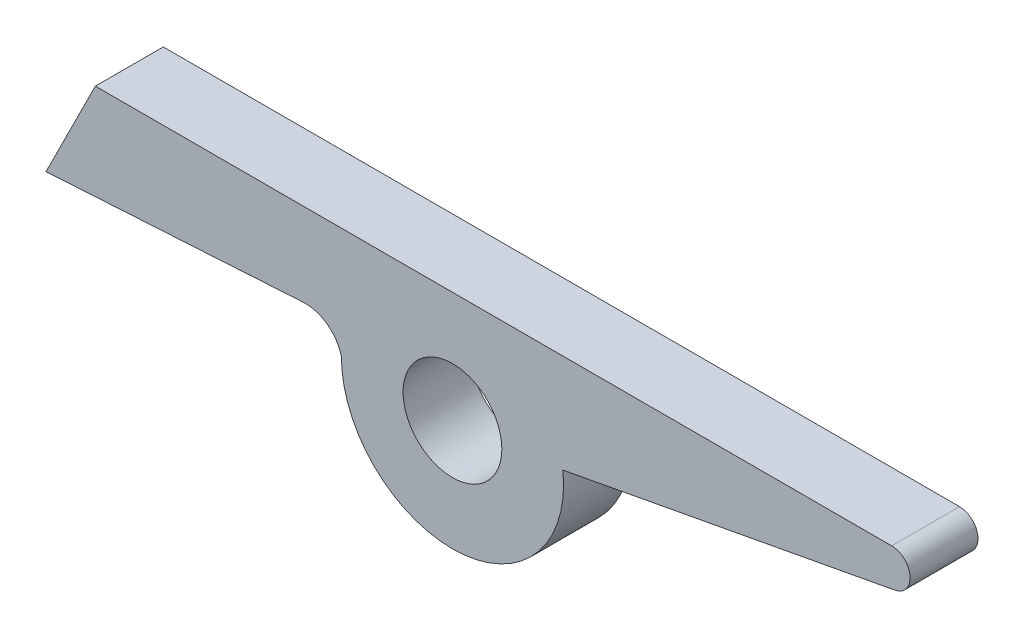
ISO-10303-21;
HEADER;
FILE_DESCRIPTION(('STEP AP214'),'2;1');
FILE_NAME('part.step','',(''),(''),'','','');
FILE_SCHEMA(('AUTOMOTIVE_DESIGN { 1 0 10303 214 1 1 1 1 }'));
ENDSEC;
DATA;
#1=APPLICATION_CONTEXT('core data for automotive mechanical design processes');
#2=APPLICATION_PROTOCOL_DEFINITION('international standard','automotive_design',2000,#1);
#3=PRODUCT_CONTEXT('',#1,'mechanical');
#4=PRODUCT('Part','Part','',(#3));
#5=PRODUCT_RELATED_PRODUCT_CATEGORY('part','',(#4));
#6=PRODUCT_DEFINITION_FORMATION('','',#4);
#7=PRODUCT_DEFINITION_CONTEXT('part definition',#1,'design');
#8=PRODUCT_DEFINITION('design','',#6,#7);
#9=PRODUCT_DEFINITION_SHAPE('','',#8);
#10=(LENGTH_UNIT() NAMED_UNIT(*) SI_UNIT(.MILLI.,.METRE.));
#11=(NAMED_UNIT(*) PLANE_ANGLE_UNIT() SI_UNIT($,.RADIAN.));
#12=(NAMED_UNIT(*) SI_UNIT($,.STERADIAN.) SOLID_ANGLE_UNIT());
#13=UNCERTAINTY_MEASURE_WITH_UNIT(LENGTH_MEASURE(1.E-05),#10,'distance_accuracy_value','');
#14=(GEOMETRIC_REPRESENTATION_CONTEXT(3) GLOBAL_UNCERTAINTY_ASSIGNED_CONTEXT((#13)) GLOBAL_UNIT_ASSIGNED_CONTEXT((#10,
#11,#12)) REPRESENTATION_CONTEXT('',''));
#15=CARTESIAN_POINT('',(0.,0.,0.));
#16=DIRECTION('',(0.,0.,1.));
#17=DIRECTION('',(1.,0.,0.));
#18=AXIS2_PLACEMENT_3D('',#15,#16,#17);
#19=CARTESIAN_POINT('',(35.5726988460086,7.5,5.5));
#20=DIRECTION('',(0.,0.,-1.));
#21=DIRECTION('',(-1.,0.,0.));
#22=AXIS2_PLACEMENT_3D('',#19,#20,#21);
#23=CYLINDRICAL_SURFACE('',#22,1.5);
#24=CARTESIAN_POINT('',(35.5726988460086,7.5,0.));
#25=DIRECTION('',(0.,0.,1.));
#26=DIRECTION('',(1.,0.,0.));
#27=AXIS2_PLACEMENT_3D('',#24,#25,#26);
#28=CIRCLE('',#27,1.5);
#29=CARTESIAN_POINT('',(35.5726988460086,9.,0.));
#30=VERTEX_POINT('',#29);
#31=CARTESIAN_POINT('',(35.8480850151007,6.02549586034058,0.));
#32=VERTEX_POINT('',#31);
#33=EDGE_CURVE('E130',#30,#32,#28,.F.);
#34=ORIENTED_EDGE('',*,*,#33,.F.);
#35=DIRECTION('',(0.,0.,-1.));
#36=VECTOR('',#35,1.);
#37=CARTESIAN_POINT('',(35.5726988460086,9.,5.5));
#38=LINE('',#37,#36);
#39=CARTESIAN_POINT('',(35.5726988460086,9.,5.5));
#40=VERTEX_POINT('',#39);
#41=EDGE_CURVE('E11',#40,#30,#38,.T.);
#42=ORIENTED_EDGE('',*,*,#41,.F.);
#43=CARTESIAN_POINT('',(35.5726988460086,7.5,5.5));
#44=DIRECTION('',(0.,0.,1.));
#45=DIRECTION('',(1.,0.,0.));
#46=AXIS2_PLACEMENT_3D('',#43,#44,#45);
#47=CIRCLE('',#46,1.5);
#48=CARTESIAN_POINT('',(35.8480850151007,6.02549586034058,5.5));
#49=VERTEX_POINT('',#48);
#50=EDGE_CURVE('E148',#40,#49,#47,.F.);
#51=ORIENTED_EDGE('',*,*,#50,.T.);
#52=DIRECTION('',(0.,0.,-1.));
#53=VECTOR('',#52,1.);
#54=CARTESIAN_POINT('',(35.8480850151007,6.02549586034058,5.5));
#55=LINE('',#54,#53);
#56=EDGE_CURVE('E55',#49,#32,#55,.T.);
#57=ORIENTED_EDGE('',*,*,#56,.T.);
#58=EDGE_LOOP('',(#34,#42,#51,#57));
#59=FACE_BOUND('',#58,.T.);
#60=ADVANCED_FACE('F39',(#59),#23,.T.);
#61=CARTESIAN_POINT('',(0.,9.,5.5));
#62=DIRECTION('',(0.,1.,0.));
#63=DIRECTION('',(0.,0.,1.));
#64=AXIS2_PLACEMENT_3D('',#61,#62,#63);
#65=PLANE('',#64);
#66=DIRECTION('',(1.,0.,0.));
#67=VECTOR('',#66,1.);
#68=CARTESIAN_POINT('',(0.,9.,0.));
#69=LINE('',#68,#67);
#70=CARTESIAN_POINT('',(-28.9273011539915,9.,0.));
#71=VERTEX_POINT('',#70);
#72=EDGE_CURVE('E132',#71,#30,#69,.T.);
#73=ORIENTED_EDGE('',*,*,#72,.F.);
#74=DIRECTION('',(0.,0.,-1.));
#75=VECTOR('',#74,1.);
#76=CARTESIAN_POINT('',(-28.9273011539915,9.,5.5));
#77=LINE('',#76,#75);
#78=CARTESIAN_POINT('',(-28.9273011539915,9.,5.5));
#79=VERTEX_POINT('',#78);
#80=EDGE_CURVE('E47',#79,#71,#77,.T.);
#81=ORIENTED_EDGE('',*,*,#80,.F.);
#82=DIRECTION('',(1.,0.,0.));
#83=VECTOR('',#82,1.);
#84=CARTESIAN_POINT('',(0.,9.,5.5));
#85=LINE('',#84,#83);
#86=EDGE_CURVE('E169',#79,#40,#85,.T.);
#87=ORIENTED_EDGE('',*,*,#86,.T.);
#88=ORIENTED_EDGE('',*,*,#41,.T.);
#89=EDGE_LOOP('',(#73,#81,#87,#88));
#90=FACE_BOUND('',#89,.T.);
#91=ADVANCED_FACE('F168',(#90),#65,.T.);
#92=CARTESIAN_POINT('',(-26.7418409231932,13.3709204615966,5.5));
#93=DIRECTION('',(0.894427190999916,-0.447213595499958,0.));
#94=DIRECTION('',(0.447213595499958,0.894427190999916,0.));
#95=AXIS2_PLACEMENT_3D('',#92,#93,#94);
#96=PLANE('',#95);
#97=DIRECTION('',(-0.447213595499958,-0.894427190999916,0.));
#98=VECTOR('',#97,1.);
#99=CARTESIAN_POINT('',(-26.7418409231932,13.3709204615966,0.));
#100=LINE('',#99,#98);
#101=CARTESIAN_POINT('',(-32.9273011539915,1.,0.));
#102=VERTEX_POINT('',#101);
#103=EDGE_CURVE('E135',#71,#102,#100,.T.);
#104=ORIENTED_EDGE('',*,*,#103,.T.);
#105=DIRECTION('',(0.,0.,-1.));
#106=VECTOR('',#105,1.);
#107=CARTESIAN_POINT('',(-32.9273011539915,1.,5.5));
#108=LINE('',#107,#106);
#109=CARTESIAN_POINT('',(-32.9273011539915,1.,5.5));
#110=VERTEX_POINT('',#109);
#111=EDGE_CURVE('E152',#110,#102,#108,.T.);
#112=ORIENTED_EDGE('',*,*,#111,.F.);
#113=DIRECTION('',(-0.447213595499958,-0.894427190999916,0.));
#114=VECTOR('',#113,1.);
#115=CARTESIAN_POINT('',(-26.7418409231932,13.3709204615966,5.5));
#116=LINE('',#115,#114);
#117=EDGE_CURVE('E159',#79,#110,#116,.T.);
#118=ORIENTED_EDGE('',*,*,#117,.F.);
#119=ORIENTED_EDGE('',*,*,#80,.T.);
#120=EDGE_LOOP('',(#104,#112,#118,#119));
#121=FACE_BOUND('',#120,.T.);
#122=ADVANCED_FACE('F157',(#121),#96,.F.);
#123=CARTESIAN_POINT('',(-0.178887997419528,2.97149712689424,5.5));
#124=DIRECTION('',(-0.0600925074490775,0.998192812310569,0.));
#125=DIRECTION('',(-0.998192812310569,-0.0600925074490775,0.));
#126=AXIS2_PLACEMENT_3D('',#123,#124,#125);
#127=PLANE('',#126);
#128=DIRECTION('',(0.998192812310569,0.0600925074490775,0.));
#129=VECTOR('',#128,1.);
#130=CARTESIAN_POINT('',(-0.178887997419528,2.97149712689424,0.));
#131=LINE('',#130,#129);
#132=CARTESIAN_POINT('',(-12.0875786763387,2.25457843693171,0.));
#133=VERTEX_POINT('',#132);
#134=EDGE_CURVE('E137',#102,#133,#131,.T.);
#135=ORIENTED_EDGE('',*,*,#134,.T.);
#136=DIRECTION('',(0.,0.,-1.));
#137=VECTOR('',#136,1.);
#138=CARTESIAN_POINT('',(-12.0875786763387,2.25457843693171,5.5));
#139=LINE('',#138,#137);
#140=CARTESIAN_POINT('',(-12.0875786763387,2.25457843693171,5.5));
#141=VERTEX_POINT('',#140);
#142=EDGE_CURVE('E119',#141,#133,#139,.T.);
#143=ORIENTED_EDGE('',*,*,#142,.F.);
#144=DIRECTION('',(0.998192812310569,0.0600925074490775,0.));
#145=VECTOR('',#144,1.);
#146=CARTESIAN_POINT('',(-0.178887997419528,2.97149712689424,5.5));
#147=LINE('',#146,#145);
#148=EDGE_CURVE('E107',#110,#141,#147,.T.);
#149=ORIENTED_EDGE('',*,*,#148,.F.);
#150=ORIENTED_EDGE('',*,*,#111,.T.);
#151=EDGE_LOOP('',(#135,#143,#149,#150));
#152=FACE_BOUND('',#151,.T.);
#153=ADVANCED_FACE('F188',(#152),#127,.F.);
#154=CARTESIAN_POINT('',(-11.9073011539914,-0.740000000000001,5.5));
#155=DIRECTION('',(0.,0.,-1.));
#156=DIRECTION('',(-1.,0.,0.));
#157=AXIS2_PLACEMENT_3D('',#154,#155,#156);
#158=CYLINDRICAL_SURFACE('',#157,3.);
#159=CARTESIAN_POINT('',(-11.9073011539914,-0.740000000000001,0.));
#160=DIRECTION('',(0.,0.,1.));
#161=DIRECTION('',(1.,0.,0.));
#162=AXIS2_PLACEMENT_3D('',#159,#160,#161);
#163=CIRCLE('',#162,3.);
#164=CARTESIAN_POINT('',(-9.,0.,0.));
#165=VERTEX_POINT('',#164);
#166=EDGE_CURVE('E116',#133,#165,#163,.F.);
#167=ORIENTED_EDGE('',*,*,#166,.T.);
#168=DIRECTION('',(0.,0.,-1.));
#169=VECTOR('',#168,1.);
#170=CARTESIAN_POINT('',(-9.,0.,5.5));
#171=LINE('',#170,#169);
#172=CARTESIAN_POINT('',(-9.,0.,5.5));
#173=VERTEX_POINT('',#172);
#174=EDGE_CURVE('E113',#173,#165,#171,.T.);
#175=ORIENTED_EDGE('',*,*,#174,.F.);
#176=CARTESIAN_POINT('',(-11.9073011539914,-0.740000000000001,5.5));
#177=DIRECTION('',(0.,0.,1.));
#178=DIRECTION('',(1.,0.,0.));
#179=AXIS2_PLACEMENT_3D('',#176,#177,#178);
#180=CIRCLE('',#179,3.);
#181=EDGE_CURVE('E99',#141,#173,#180,.F.);
#182=ORIENTED_EDGE('',*,*,#181,.F.);
#183=ORIENTED_EDGE('',*,*,#142,.T.);
#184=EDGE_LOOP('',(#167,#175,#182,#183));
#185=FACE_BOUND('',#184,.T.);
#186=ADVANCED_FACE('F114',(#185),#158,.F.);
#187=CARTESIAN_POINT('',(0.,0.,5.5));
#188=DIRECTION('',(0.,0.,-1.));
#189=DIRECTION('',(-1.,0.,0.));
#190=AXIS2_PLACEMENT_3D('',#187,#188,#189);
#191=CYLINDRICAL_SURFACE('',#190,9.);
#192=CARTESIAN_POINT('',(0.,0.,0.));
#193=DIRECTION('',(0.,0.,1.));
#194=DIRECTION('',(1.,0.,0.));
#195=AXIS2_PLACEMENT_3D('',#192,#193,#194);
#196=CIRCLE('',#195,9.);
#197=CARTESIAN_POINT('',(8.94418449893838,1.00078151908917,0.));
#198=VERTEX_POINT('',#197);
#199=EDGE_CURVE('E140',#165,#198,#196,.T.);
#200=ORIENTED_EDGE('',*,*,#199,.T.);
#201=DIRECTION('',(0.,0.,-1.));
#202=VECTOR('',#201,1.);
#203=CARTESIAN_POINT('',(8.94418449893838,1.00078151908917,5.5));
#204=LINE('',#203,#202);
#205=CARTESIAN_POINT('',(8.94418449893838,1.00078151908917,5.5));
#206=VERTEX_POINT('',#205);
#207=EDGE_CURVE('E78',#206,#198,#204,.T.);
#208=ORIENTED_EDGE('',*,*,#207,.F.);
#209=CARTESIAN_POINT('',(0.,0.,5.5));
#210=DIRECTION('',(0.,0.,1.));
#211=DIRECTION('',(1.,0.,0.));
#212=AXIS2_PLACEMENT_3D('',#209,#210,#211);
#213=CIRCLE('',#212,9.);
#214=EDGE_CURVE('E105',#173,#206,#213,.T.);
#215=ORIENTED_EDGE('',*,*,#214,.F.);
#216=ORIENTED_EDGE('',*,*,#174,.T.);
#217=EDGE_LOOP('',(#200,#208,#215,#216));
#218=FACE_BOUND('',#217,.T.);
#219=ADVANCED_FACE('F121',(#218),#191,.T.);
#220=CARTESIAN_POINT('',(0.120857591238296,-0.647109545035019,5.5));
#221=DIRECTION('',(0.183590779394742,-0.983002759772947,0.));
#222=DIRECTION('',(0.983002759772947,0.183590779394742,0.));
#223=AXIS2_PLACEMENT_3D('',#220,#221,#222);
#224=PLANE('',#223);
#225=DIRECTION('',(-0.983002759772947,-0.183590779394742,0.));
#226=VECTOR('',#225,1.);
#227=CARTESIAN_POINT('',(0.120857591238296,-0.647109545035019,0.));
#228=LINE('',#227,#226);
#229=EDGE_CURVE('E142',#32,#198,#228,.T.);
#230=ORIENTED_EDGE('',*,*,#229,.F.);
#231=ORIENTED_EDGE('',*,*,#56,.F.);
#232=DIRECTION('',(-0.983002759772947,-0.183590779394742,0.));
#233=VECTOR('',#232,1.);
#234=CARTESIAN_POINT('',(0.120857591238296,-0.647109545035019,5.5));
#235=LINE('',#234,#233);
#236=EDGE_CURVE('E122',#49,#206,#235,.T.);
#237=ORIENTED_EDGE('',*,*,#236,.T.);
#238=ORIENTED_EDGE('',*,*,#207,.T.);
#239=EDGE_LOOP('',(#230,#231,#237,#238));
#240=FACE_BOUND('',#239,.T.);
#241=ADVANCED_FACE('F170',(#240),#224,.T.);
#242=CARTESIAN_POINT('',(0.,0.,5.5));
#243=DIRECTION('',(0.,0.,-1.));
#244=DIRECTION('',(-1.,0.,0.));
#245=AXIS2_PLACEMENT_3D('',#242,#243,#244);
#246=CYLINDRICAL_SURFACE('',#245,4.);
#247=CARTESIAN_POINT('',(0.,0.,5.5));
#248=DIRECTION('',(0.,0.,1.));
#249=DIRECTION('',(1.,0.,0.));
#250=AXIS2_PLACEMENT_3D('',#247,#248,#249);
#251=CIRCLE('',#250,4.);
#252=CARTESIAN_POINT('',(4.,0.,5.5));
#253=VERTEX_POINT('',#252);
#254=EDGE_CURVE('E124',#253,#253,#251,.T.);
#255=ORIENTED_EDGE('',*,*,#254,.T.);
#256=EDGE_LOOP('',(#255));
#257=FACE_BOUND('',#256,.T.);
#258=CARTESIAN_POINT('',(0.,0.,0.));
#259=DIRECTION('',(0.,0.,1.));
#260=DIRECTION('',(1.,0.,0.));
#261=AXIS2_PLACEMENT_3D('',#258,#259,#260);
#262=CIRCLE('',#261,4.);
#263=CARTESIAN_POINT('',(4.,0.,0.));
#264=VERTEX_POINT('',#263);
#265=EDGE_CURVE('E145',#264,#264,#262,.T.);
#266=ORIENTED_EDGE('',*,*,#265,.F.);
#267=EDGE_LOOP('',(#266));
#268=FACE_BOUND('',#267,.T.);
#269=ADVANCED_FACE('F172',(#257,#268),#246,.F.);
#270=CARTESIAN_POINT('',(0.,0.,5.5));
#271=DIRECTION('',(0.,0.,1.));
#272=DIRECTION('',(1.,0.,0.));
#273=AXIS2_PLACEMENT_3D('',#270,#271,#272);
#274=PLANE('',#273);
#275=ORIENTED_EDGE('',*,*,#50,.F.);
#276=ORIENTED_EDGE('',*,*,#86,.F.);
#277=ORIENTED_EDGE('',*,*,#117,.T.);
#278=ORIENTED_EDGE('',*,*,#148,.T.);
#279=ORIENTED_EDGE('',*,*,#181,.T.);
#280=ORIENTED_EDGE('',*,*,#214,.T.);
#281=ORIENTED_EDGE('',*,*,#236,.F.);
#282=EDGE_LOOP('',(#275,#276,#277,#278,#279,#280,#281));
#283=FACE_BOUND('',#282,.T.);
#284=ORIENTED_EDGE('',*,*,#254,.F.);
#285=EDGE_LOOP('',(#284));
#286=FACE_BOUND('',#285,.T.);
#287=ADVANCED_FACE('F101',(#283,#286),#274,.T.);
#288=CARTESIAN_POINT('',(0.,0.,0.));
#289=DIRECTION('',(0.,0.,1.));
#290=DIRECTION('',(1.,0.,0.));
#291=AXIS2_PLACEMENT_3D('',#288,#289,#290);
#292=PLANE('',#291);
#293=ORIENTED_EDGE('',*,*,#33,.T.);
#294=ORIENTED_EDGE('',*,*,#229,.T.);
#295=ORIENTED_EDGE('',*,*,#199,.F.);
#296=ORIENTED_EDGE('',*,*,#166,.F.);
#297=ORIENTED_EDGE('',*,*,#134,.F.);
#298=ORIENTED_EDGE('',*,*,#103,.F.);
#299=ORIENTED_EDGE('',*,*,#72,.T.);
#300=EDGE_LOOP('',(#293,#294,#295,#296,#297,#298,#299));
#301=FACE_BOUND('',#300,.T.);
#302=ORIENTED_EDGE('',*,*,#265,.T.);
#303=EDGE_LOOP('',(#302));
#304=FACE_BOUND('',#303,.T.);
#305=ADVANCED_FACE('F166',(#301,#304),#292,.F.);
#306=CLOSED_SHELL('',(#60,#91,#122,#153,#186,#219,#241,#269,#287,#305));
#307=MANIFOLD_SOLID_BREP('B2',#306);
#308=ADVANCED_BREP_SHAPE_REPRESENTATION('',(#18,#307),#14);
#309=SHAPE_DEFINITION_REPRESENTATION(#9,#308);
ENDSEC;
END-ISO-10303-21;
